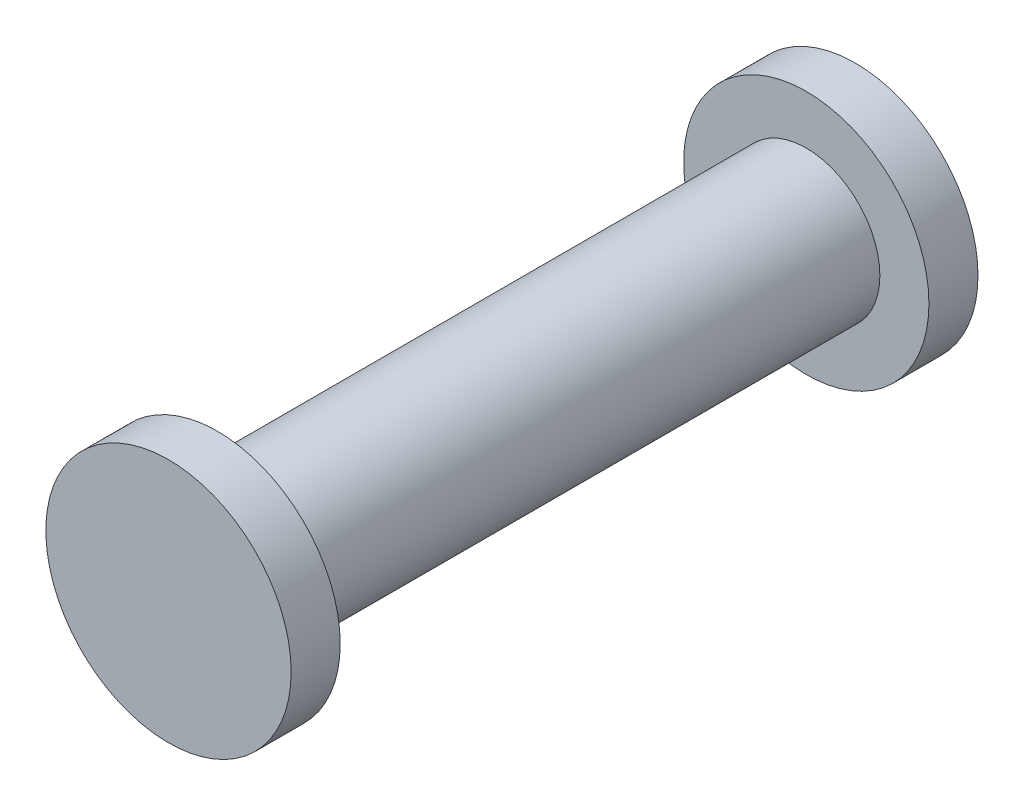
ISO-10303-21;
HEADER;
FILE_DESCRIPTION(('STEP AP214'),'2;1');
FILE_NAME('part.step','',(''),(''),'','','');
FILE_SCHEMA(('AUTOMOTIVE_DESIGN { 1 0 10303 214 1 1 1 1 }'));
ENDSEC;
DATA;
#1=APPLICATION_CONTEXT('core data for automotive mechanical design processes');
#2=APPLICATION_PROTOCOL_DEFINITION('international standard','automotive_design',2000,#1);
#3=PRODUCT_CONTEXT('',#1,'mechanical');
#4=PRODUCT('Part','Part','',(#3));
#5=PRODUCT_RELATED_PRODUCT_CATEGORY('part','',(#4));
#6=PRODUCT_DEFINITION_FORMATION('','',#4);
#7=PRODUCT_DEFINITION_CONTEXT('part definition',#1,'design');
#8=PRODUCT_DEFINITION('design','',#6,#7);
#9=PRODUCT_DEFINITION_SHAPE('','',#8);
#10=(LENGTH_UNIT() NAMED_UNIT(*) SI_UNIT(.MILLI.,.METRE.));
#11=(NAMED_UNIT(*) PLANE_ANGLE_UNIT() SI_UNIT($,.RADIAN.));
#12=(NAMED_UNIT(*) SI_UNIT($,.STERADIAN.) SOLID_ANGLE_UNIT());
#13=UNCERTAINTY_MEASURE_WITH_UNIT(LENGTH_MEASURE(1.E-05),#10,'distance_accuracy_value','');
#14=(GEOMETRIC_REPRESENTATION_CONTEXT(3) GLOBAL_UNCERTAINTY_ASSIGNED_CONTEXT((#13)) GLOBAL_UNIT_ASSIGNED_CONTEXT((#10,
#11,#12)) REPRESENTATION_CONTEXT('',''));
#15=CARTESIAN_POINT('',(0.,0.,0.));
#16=DIRECTION('',(0.,0.,1.));
#17=DIRECTION('',(1.,0.,0.));
#18=AXIS2_PLACEMENT_3D('',#15,#16,#17);
#19=CARTESIAN_POINT('',(0.,0.,1.));
#20=DIRECTION('',(0.,0.,-1.));
#21=DIRECTION('',(-1.,0.,0.));
#22=AXIS2_PLACEMENT_3D('',#19,#20,#21);
#23=CYLINDRICAL_SURFACE('',#22,2.5);
#24=CARTESIAN_POINT('',(0.,0.,1.));
#25=DIRECTION('',(0.,0.,1.));
#26=DIRECTION('',(1.,0.,0.));
#27=AXIS2_PLACEMENT_3D('',#24,#25,#26);
#28=CIRCLE('',#27,2.5);
#29=CARTESIAN_POINT('',(2.5,0.,1.));
#30=VERTEX_POINT('',#29);
#31=EDGE_CURVE('E41',#30,#30,#28,.T.);
#32=ORIENTED_EDGE('',*,*,#31,.F.);
#33=EDGE_LOOP('',(#32));
#34=FACE_BOUND('',#33,.T.);
#35=CARTESIAN_POINT('',(0.,0.,0.));
#36=DIRECTION('',(0.,0.,1.));
#37=DIRECTION('',(1.,0.,0.));
#38=AXIS2_PLACEMENT_3D('',#35,#36,#37);
#39=CIRCLE('',#38,2.5);
#40=CARTESIAN_POINT('',(2.5,0.,0.));
#41=VERTEX_POINT('',#40);
#42=EDGE_CURVE('E37',#41,#41,#39,.T.);
#43=ORIENTED_EDGE('',*,*,#42,.T.);
#44=EDGE_LOOP('',(#43));
#45=FACE_BOUND('',#44,.T.);
#46=ADVANCED_FACE('F34',(#34,#45),#23,.T.);
#47=CARTESIAN_POINT('',(0.,0.,1.));
#48=DIRECTION('',(0.,0.,1.));
#49=DIRECTION('',(1.,0.,0.));
#50=AXIS2_PLACEMENT_3D('',#47,#48,#49);
#51=PLANE('',#50);
#52=CARTESIAN_POINT('',(0.,0.,1.));
#53=DIRECTION('',(0.,0.,1.));
#54=DIRECTION('',(1.,0.,0.));
#55=AXIS2_PLACEMENT_3D('',#52,#53,#54);
#56=CIRCLE('',#55,1.5);
#57=CARTESIAN_POINT('',(1.5,0.,1.));
#58=VERTEX_POINT('',#57);
#59=EDGE_CURVE('E10',#58,#58,#56,.T.);
#60=ORIENTED_EDGE('',*,*,#59,.F.);
#61=EDGE_LOOP('',(#60));
#62=FACE_BOUND('',#61,.T.);
#63=ORIENTED_EDGE('',*,*,#31,.T.);
#64=EDGE_LOOP('',(#63));
#65=FACE_BOUND('',#64,.T.);
#66=ADVANCED_FACE('F75',(#62,#65),#51,.T.);
#67=CARTESIAN_POINT('',(0.,0.,0.));
#68=DIRECTION('',(0.,0.,1.));
#69=DIRECTION('',(1.,0.,0.));
#70=AXIS2_PLACEMENT_3D('',#67,#68,#69);
#71=PLANE('',#70);
#72=ORIENTED_EDGE('',*,*,#42,.F.);
#73=EDGE_LOOP('',(#72));
#74=FACE_BOUND('',#73,.T.);
#75=ADVANCED_FACE('F80',(#74),#71,.F.);
#76=CARTESIAN_POINT('',(0.,0.,13.));
#77=DIRECTION('',(0.,0.,-1.));
#78=DIRECTION('',(-1.,0.,0.));
#79=AXIS2_PLACEMENT_3D('',#76,#77,#78);
#80=CYLINDRICAL_SURFACE('',#79,1.5);
#81=CARTESIAN_POINT('',(0.,0.,13.));
#82=DIRECTION('',(0.,0.,1.));
#83=DIRECTION('',(1.,0.,0.));
#84=AXIS2_PLACEMENT_3D('',#81,#82,#83);
#85=CIRCLE('',#84,1.5);
#86=CARTESIAN_POINT('',(1.5,0.,13.));
#87=VERTEX_POINT('',#86);
#88=EDGE_CURVE('E47',#87,#87,#85,.T.);
#89=ORIENTED_EDGE('',*,*,#88,.F.);
#90=EDGE_LOOP('',(#89));
#91=FACE_BOUND('',#90,.T.);
#92=ORIENTED_EDGE('',*,*,#59,.T.);
#93=EDGE_LOOP('',(#92));
#94=FACE_BOUND('',#93,.T.);
#95=ADVANCED_FACE('F62',(#91,#94),#80,.T.);
#96=CARTESIAN_POINT('',(0.,0.,14.));
#97=DIRECTION('',(0.,0.,-1.));
#98=DIRECTION('',(-1.,0.,0.));
#99=AXIS2_PLACEMENT_3D('',#96,#97,#98);
#100=CYLINDRICAL_SURFACE('',#99,2.5);
#101=CARTESIAN_POINT('',(0.,0.,14.));
#102=DIRECTION('',(0.,0.,1.));
#103=DIRECTION('',(1.,0.,0.));
#104=AXIS2_PLACEMENT_3D('',#101,#102,#103);
#105=CIRCLE('',#104,2.5);
#106=CARTESIAN_POINT('',(2.5,0.,14.));
#107=VERTEX_POINT('',#106);
#108=EDGE_CURVE('E50',#107,#107,#105,.T.);
#109=ORIENTED_EDGE('',*,*,#108,.F.);
#110=EDGE_LOOP('',(#109));
#111=FACE_BOUND('',#110,.T.);
#112=CARTESIAN_POINT('',(0.,0.,13.));
#113=DIRECTION('',(0.,0.,1.));
#114=DIRECTION('',(1.,0.,0.));
#115=AXIS2_PLACEMENT_3D('',#112,#113,#114);
#116=CIRCLE('',#115,2.5);
#117=CARTESIAN_POINT('',(2.5,0.,13.));
#118=VERTEX_POINT('',#117);
#119=EDGE_CURVE('E51',#118,#118,#116,.T.);
#120=ORIENTED_EDGE('',*,*,#119,.T.);
#121=EDGE_LOOP('',(#120));
#122=FACE_BOUND('',#121,.T.);
#123=ADVANCED_FACE('F59',(#111,#122),#100,.T.);
#124=CARTESIAN_POINT('',(0.,0.,14.));
#125=DIRECTION('',(0.,0.,1.));
#126=DIRECTION('',(1.,0.,0.));
#127=AXIS2_PLACEMENT_3D('',#124,#125,#126);
#128=PLANE('',#127);
#129=ORIENTED_EDGE('',*,*,#108,.T.);
#130=EDGE_LOOP('',(#129));
#131=FACE_BOUND('',#130,.T.);
#132=ADVANCED_FACE('F57',(#131),#128,.T.);
#133=CARTESIAN_POINT('',(0.,0.,13.));
#134=DIRECTION('',(0.,0.,1.));
#135=DIRECTION('',(1.,0.,0.));
#136=AXIS2_PLACEMENT_3D('',#133,#134,#135);
#137=PLANE('',#136);
#138=ORIENTED_EDGE('',*,*,#88,.T.);
#139=EDGE_LOOP('',(#138));
#140=FACE_BOUND('',#139,.T.);
#141=ORIENTED_EDGE('',*,*,#119,.F.);
#142=EDGE_LOOP('',(#141));
#143=FACE_BOUND('',#142,.T.);
#144=ADVANCED_FACE('F66',(#140,#143),#137,.F.);
#145=CLOSED_SHELL('',(#46,#66,#75,#95,#123,#132,#144));
#146=MANIFOLD_SOLID_BREP('B2',#145);
#147=ADVANCED_BREP_SHAPE_REPRESENTATION('',(#18,#146),#14);
#148=SHAPE_DEFINITION_REPRESENTATION(#9,#147);
ENDSEC;
END-ISO-10303-21;
